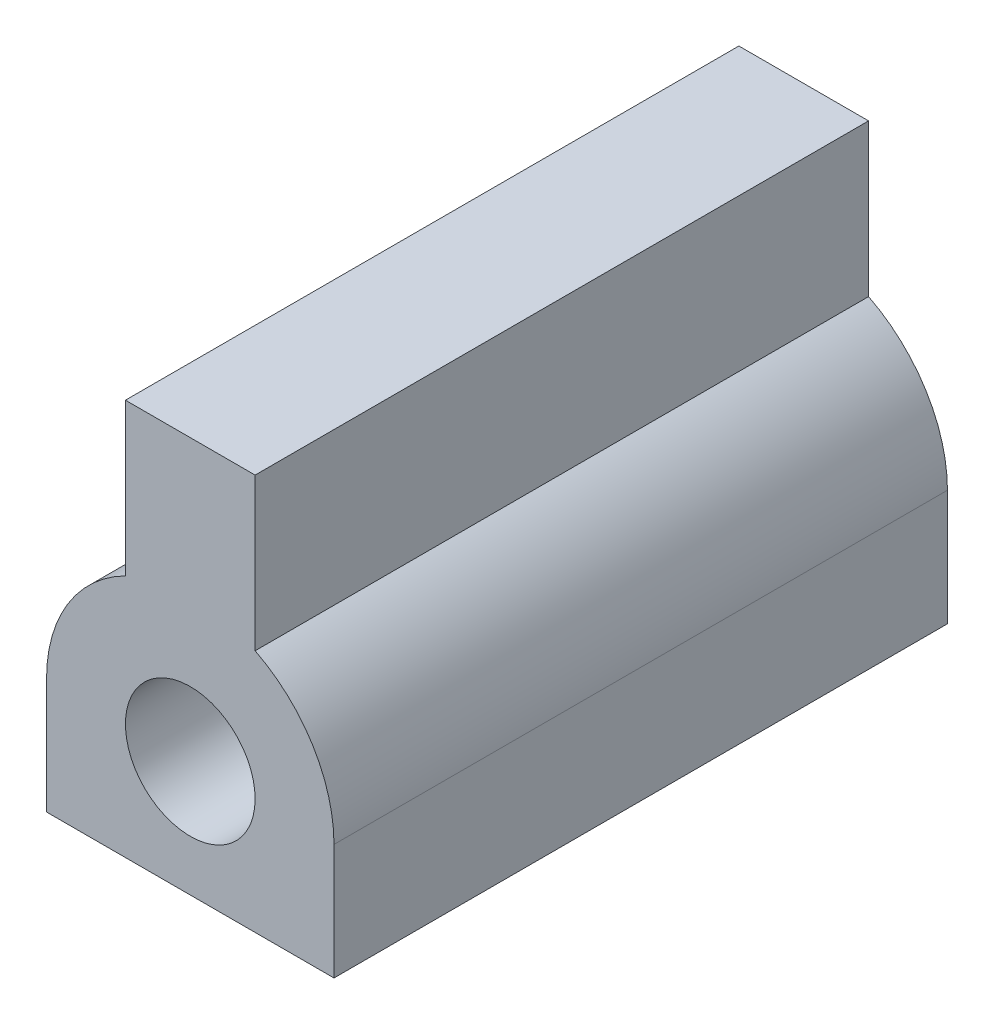
ISO-10303-21;
HEADER;
FILE_DESCRIPTION(('STEP AP214'),'2;1');
FILE_NAME('part.step','',(''),(''),'','','');
FILE_SCHEMA(('AUTOMOTIVE_DESIGN { 1 0 10303 214 1 1 1 1 }'));
ENDSEC;
DATA;
#1=APPLICATION_CONTEXT('core data for automotive mechanical design processes');
#2=APPLICATION_PROTOCOL_DEFINITION('international standard','automotive_design',2000,#1);
#3=PRODUCT_CONTEXT('',#1,'mechanical');
#4=PRODUCT('Part','Part','',(#3));
#5=PRODUCT_RELATED_PRODUCT_CATEGORY('part','',(#4));
#6=PRODUCT_DEFINITION_FORMATION('','',#4);
#7=PRODUCT_DEFINITION_CONTEXT('part definition',#1,'design');
#8=PRODUCT_DEFINITION('design','',#6,#7);
#9=PRODUCT_DEFINITION_SHAPE('','',#8);
#10=(LENGTH_UNIT() NAMED_UNIT(*) SI_UNIT(.MILLI.,.METRE.));
#11=(NAMED_UNIT(*) PLANE_ANGLE_UNIT() SI_UNIT($,.RADIAN.));
#12=(NAMED_UNIT(*) SI_UNIT($,.STERADIAN.) SOLID_ANGLE_UNIT());
#13=UNCERTAINTY_MEASURE_WITH_UNIT(LENGTH_MEASURE(1.E-05),#10,'distance_accuracy_value','');
#14=(GEOMETRIC_REPRESENTATION_CONTEXT(3) GLOBAL_UNCERTAINTY_ASSIGNED_CONTEXT((#13)) GLOBAL_UNIT_ASSIGNED_CONTEXT((#10,
#11,#12)) REPRESENTATION_CONTEXT('',''));
#15=CARTESIAN_POINT('',(0.,0.,0.));
#16=DIRECTION('',(0.,0.,1.));
#17=DIRECTION('',(1.,0.,0.));
#18=AXIS2_PLACEMENT_3D('',#15,#16,#17);
#19=CARTESIAN_POINT('',(0.,0.,22.225));
#20=DIRECTION('',(0.,0.,-1.));
#21=DIRECTION('',(-1.,0.,0.));
#22=AXIS2_PLACEMENT_3D('',#19,#20,#21);
#23=PLANE('',#22);
#24=DIRECTION('',(0.,-1.,0.));
#25=VECTOR('',#24,1.);
#26=CARTESIAN_POINT('',(-10.414,-8.382,22.225));
#27=LINE('',#26,#25);
#28=CARTESIAN_POINT('',(-10.414,0.,22.225));
#29=VERTEX_POINT('',#28);
#30=CARTESIAN_POINT('',(-10.414,-8.382,22.225));
#31=VERTEX_POINT('',#30);
#32=EDGE_CURVE('E146',#29,#31,#27,.T.);
#33=ORIENTED_EDGE('',*,*,#32,.T.);
#34=DIRECTION('',(1.,0.,0.));
#35=VECTOR('',#34,1.);
#36=CARTESIAN_POINT('',(10.414,-8.382,22.225));
#37=LINE('',#36,#35);
#38=CARTESIAN_POINT('',(10.414,-8.382,22.225));
#39=VERTEX_POINT('',#38);
#40=EDGE_CURVE('E94',#31,#39,#37,.T.);
#41=ORIENTED_EDGE('',*,*,#40,.T.);
#42=DIRECTION('',(0.,1.,0.));
#43=VECTOR('',#42,1.);
#44=CARTESIAN_POINT('',(10.414,0.,22.225));
#45=LINE('',#44,#43);
#46=CARTESIAN_POINT('',(10.414,0.,22.225));
#47=VERTEX_POINT('',#46);
#48=EDGE_CURVE('E161',#39,#47,#45,.T.);
#49=ORIENTED_EDGE('',*,*,#48,.T.);
#50=CARTESIAN_POINT('',(0.,0.,22.225));
#51=DIRECTION('',(0.,0.,1.));
#52=DIRECTION('',(-1.,0.,0.));
#53=AXIS2_PLACEMENT_3D('',#50,#51,#52);
#54=CIRCLE('',#53,10.414);
#55=CARTESIAN_POINT('',(4.699,9.29358891924966,22.225));
#56=VERTEX_POINT('',#55);
#57=EDGE_CURVE('E174',#47,#56,#54,.T.);
#58=ORIENTED_EDGE('',*,*,#57,.T.);
#59=DIRECTION('',(0.,1.,0.));
#60=VECTOR('',#59,1.);
#61=CARTESIAN_POINT('',(4.699,20.32,22.225));
#62=LINE('',#61,#60);
#63=CARTESIAN_POINT('',(4.699,20.32,22.225));
#64=VERTEX_POINT('',#63);
#65=EDGE_CURVE('E113',#56,#64,#62,.T.);
#66=ORIENTED_EDGE('',*,*,#65,.T.);
#67=DIRECTION('',(-1.,0.,0.));
#68=VECTOR('',#67,1.);
#69=CARTESIAN_POINT('',(-4.699,20.32,22.225));
#70=LINE('',#69,#68);
#71=CARTESIAN_POINT('',(-4.699,20.32,22.225));
#72=VERTEX_POINT('',#71);
#73=EDGE_CURVE('E107',#64,#72,#70,.T.);
#74=ORIENTED_EDGE('',*,*,#73,.T.);
#75=DIRECTION('',(0.,-1.,0.));
#76=VECTOR('',#75,1.);
#77=CARTESIAN_POINT('',(-4.699,9.29358891924965,22.225));
#78=LINE('',#77,#76);
#79=CARTESIAN_POINT('',(-4.699,9.29358891924965,22.225));
#80=VERTEX_POINT('',#79);
#81=EDGE_CURVE('E111',#72,#80,#78,.T.);
#82=ORIENTED_EDGE('',*,*,#81,.T.);
#83=CARTESIAN_POINT('',(0.,0.,22.225));
#84=DIRECTION('',(0.,0.,1.));
#85=DIRECTION('',(-1.,0.,0.));
#86=AXIS2_PLACEMENT_3D('',#83,#84,#85);
#87=CIRCLE('',#86,10.414);
#88=EDGE_CURVE('E51',#80,#29,#87,.T.);
#89=ORIENTED_EDGE('',*,*,#88,.T.);
#90=EDGE_LOOP('',(#33,#41,#49,#58,#66,#74,#82,#89));
#91=FACE_BOUND('',#90,.T.);
#92=CARTESIAN_POINT('',(0.,0.,22.225));
#93=DIRECTION('',(0.,0.,1.));
#94=DIRECTION('',(1.,0.,0.));
#95=AXIS2_PLACEMENT_3D('',#92,#93,#94);
#96=CIRCLE('',#95,4.699);
#97=CARTESIAN_POINT('',(4.699,0.,22.225));
#98=VERTEX_POINT('',#97);
#99=EDGE_CURVE('E135',#98,#98,#96,.T.);
#100=ORIENTED_EDGE('',*,*,#99,.F.);
#101=EDGE_LOOP('',(#100));
#102=FACE_BOUND('',#101,.T.);
#103=ADVANCED_FACE('F34',(#91,#102),#23,.F.);
#104=CARTESIAN_POINT('',(0.,0.,-22.225));
#105=DIRECTION('',(0.,0.,-1.));
#106=DIRECTION('',(-1.,0.,0.));
#107=AXIS2_PLACEMENT_3D('',#104,#105,#106);
#108=PLANE('',#107);
#109=DIRECTION('',(0.,-1.,0.));
#110=VECTOR('',#109,1.);
#111=CARTESIAN_POINT('',(-10.414,-8.382,-22.225));
#112=LINE('',#111,#110);
#113=CARTESIAN_POINT('',(-10.414,0.,-22.225));
#114=VERTEX_POINT('',#113);
#115=CARTESIAN_POINT('',(-10.414,-8.382,-22.225));
#116=VERTEX_POINT('',#115);
#117=EDGE_CURVE('E131',#114,#116,#112,.T.);
#118=ORIENTED_EDGE('',*,*,#117,.F.);
#119=CARTESIAN_POINT('',(0.,0.,-22.225));
#120=DIRECTION('',(0.,0.,1.));
#121=DIRECTION('',(-1.,0.,0.));
#122=AXIS2_PLACEMENT_3D('',#119,#120,#121);
#123=CIRCLE('',#122,10.414);
#124=CARTESIAN_POINT('',(-4.699,9.29358891924965,-22.225));
#125=VERTEX_POINT('',#124);
#126=EDGE_CURVE('E86',#125,#114,#123,.T.);
#127=ORIENTED_EDGE('',*,*,#126,.F.);
#128=DIRECTION('',(0.,-1.,0.));
#129=VECTOR('',#128,1.);
#130=CARTESIAN_POINT('',(-4.699,9.29358891924965,-22.225));
#131=LINE('',#130,#129);
#132=CARTESIAN_POINT('',(-4.699,20.32,-22.225));
#133=VERTEX_POINT('',#132);
#134=EDGE_CURVE('E80',#133,#125,#131,.T.);
#135=ORIENTED_EDGE('',*,*,#134,.F.);
#136=DIRECTION('',(-1.,0.,0.));
#137=VECTOR('',#136,1.);
#138=CARTESIAN_POINT('',(-4.699,20.32,-22.225));
#139=LINE('',#138,#137);
#140=CARTESIAN_POINT('',(4.699,20.32,-22.225));
#141=VERTEX_POINT('',#140);
#142=EDGE_CURVE('E121',#141,#133,#139,.T.);
#143=ORIENTED_EDGE('',*,*,#142,.F.);
#144=DIRECTION('',(0.,1.,0.));
#145=VECTOR('',#144,1.);
#146=CARTESIAN_POINT('',(4.699,20.32,-22.225));
#147=LINE('',#146,#145);
#148=CARTESIAN_POINT('',(4.699,9.29358891924966,-22.225));
#149=VERTEX_POINT('',#148);
#150=EDGE_CURVE('E141',#149,#141,#147,.T.);
#151=ORIENTED_EDGE('',*,*,#150,.F.);
#152=CARTESIAN_POINT('',(0.,0.,-22.225));
#153=DIRECTION('',(0.,0.,1.));
#154=DIRECTION('',(-1.,0.,0.));
#155=AXIS2_PLACEMENT_3D('',#152,#153,#154);
#156=CIRCLE('',#155,10.414);
#157=CARTESIAN_POINT('',(10.414,0.,-22.225));
#158=VERTEX_POINT('',#157);
#159=EDGE_CURVE('E139',#158,#149,#156,.T.);
#160=ORIENTED_EDGE('',*,*,#159,.F.);
#161=DIRECTION('',(0.,1.,0.));
#162=VECTOR('',#161,1.);
#163=CARTESIAN_POINT('',(10.414,0.,-22.225));
#164=LINE('',#163,#162);
#165=CARTESIAN_POINT('',(10.414,-8.382,-22.225));
#166=VERTEX_POINT('',#165);
#167=EDGE_CURVE('E137',#166,#158,#164,.T.);
#168=ORIENTED_EDGE('',*,*,#167,.F.);
#169=DIRECTION('',(1.,0.,0.));
#170=VECTOR('',#169,1.);
#171=CARTESIAN_POINT('',(10.414,-8.382,-22.225));
#172=LINE('',#171,#170);
#173=EDGE_CURVE('E134',#116,#166,#172,.T.);
#174=ORIENTED_EDGE('',*,*,#173,.F.);
#175=EDGE_LOOP('',(#118,#127,#135,#143,#151,#160,#168,#174));
#176=FACE_BOUND('',#175,.T.);
#177=CARTESIAN_POINT('',(0.,0.,-22.225));
#178=DIRECTION('',(0.,0.,1.));
#179=DIRECTION('',(1.,0.,0.));
#180=AXIS2_PLACEMENT_3D('',#177,#178,#179);
#181=CIRCLE('',#180,4.699);
#182=CARTESIAN_POINT('',(4.699,0.,-22.225));
#183=VERTEX_POINT('',#182);
#184=EDGE_CURVE('E180',#183,#183,#181,.T.);
#185=ORIENTED_EDGE('',*,*,#184,.T.);
#186=EDGE_LOOP('',(#185));
#187=FACE_BOUND('',#186,.T.);
#188=ADVANCED_FACE('F165',(#176,#187),#108,.T.);
#189=CARTESIAN_POINT('',(-10.414,-8.382,22.225));
#190=DIRECTION('',(1.,0.,0.));
#191=DIRECTION('',(0.,0.,-1.));
#192=AXIS2_PLACEMENT_3D('',#189,#190,#191);
#193=PLANE('',#192);
#194=ORIENTED_EDGE('',*,*,#117,.T.);
#195=DIRECTION('',(0.,0.,-1.));
#196=VECTOR('',#195,1.);
#197=CARTESIAN_POINT('',(-10.414,-8.382,22.225));
#198=LINE('',#197,#196);
#199=EDGE_CURVE('E11',#31,#116,#198,.T.);
#200=ORIENTED_EDGE('',*,*,#199,.F.);
#201=ORIENTED_EDGE('',*,*,#32,.F.);
#202=DIRECTION('',(0.,0.,-1.));
#203=VECTOR('',#202,1.);
#204=CARTESIAN_POINT('',(-10.414,0.,22.225));
#205=LINE('',#204,#203);
#206=EDGE_CURVE('E127',#29,#114,#205,.T.);
#207=ORIENTED_EDGE('',*,*,#206,.T.);
#208=EDGE_LOOP('',(#194,#200,#201,#207));
#209=FACE_BOUND('',#208,.T.);
#210=ADVANCED_FACE('F36',(#209),#193,.F.);
#211=CARTESIAN_POINT('',(10.414,-8.382,22.225));
#212=DIRECTION('',(0.,1.,0.));
#213=DIRECTION('',(-1.,0.,0.));
#214=AXIS2_PLACEMENT_3D('',#211,#212,#213);
#215=PLANE('',#214);
#216=ORIENTED_EDGE('',*,*,#173,.T.);
#217=DIRECTION('',(0.,0.,-1.));
#218=VECTOR('',#217,1.);
#219=CARTESIAN_POINT('',(10.414,-8.382,22.225));
#220=LINE('',#219,#218);
#221=EDGE_CURVE('E43',#39,#166,#220,.T.);
#222=ORIENTED_EDGE('',*,*,#221,.F.);
#223=ORIENTED_EDGE('',*,*,#40,.F.);
#224=ORIENTED_EDGE('',*,*,#199,.T.);
#225=EDGE_LOOP('',(#216,#222,#223,#224));
#226=FACE_BOUND('',#225,.T.);
#227=ADVANCED_FACE('F208',(#226),#215,.F.);
#228=CARTESIAN_POINT('',(10.414,0.,22.225));
#229=DIRECTION('',(-1.,0.,0.));
#230=DIRECTION('',(0.,0.,1.));
#231=AXIS2_PLACEMENT_3D('',#228,#229,#230);
#232=PLANE('',#231);
#233=ORIENTED_EDGE('',*,*,#167,.T.);
#234=DIRECTION('',(0.,0.,-1.));
#235=VECTOR('',#234,1.);
#236=CARTESIAN_POINT('',(10.414,0.,22.225));
#237=LINE('',#236,#235);
#238=EDGE_CURVE('E153',#47,#158,#237,.T.);
#239=ORIENTED_EDGE('',*,*,#238,.F.);
#240=ORIENTED_EDGE('',*,*,#48,.F.);
#241=ORIENTED_EDGE('',*,*,#221,.T.);
#242=EDGE_LOOP('',(#233,#239,#240,#241));
#243=FACE_BOUND('',#242,.T.);
#244=ADVANCED_FACE('F159',(#243),#232,.F.);
#245=CARTESIAN_POINT('',(0.,0.,22.225));
#246=DIRECTION('',(0.,0.,-1.));
#247=DIRECTION('',(-1.,0.,0.));
#248=AXIS2_PLACEMENT_3D('',#245,#246,#247);
#249=CYLINDRICAL_SURFACE('',#248,10.414);
#250=ORIENTED_EDGE('',*,*,#159,.T.);
#251=DIRECTION('',(0.,0.,-1.));
#252=VECTOR('',#251,1.);
#253=CARTESIAN_POINT('',(4.699,9.29358891924966,22.225));
#254=LINE('',#253,#252);
#255=EDGE_CURVE('E150',#56,#149,#254,.T.);
#256=ORIENTED_EDGE('',*,*,#255,.F.);
#257=ORIENTED_EDGE('',*,*,#57,.F.);
#258=ORIENTED_EDGE('',*,*,#238,.T.);
#259=EDGE_LOOP('',(#250,#256,#257,#258));
#260=FACE_BOUND('',#259,.T.);
#261=ADVANCED_FACE('F170',(#260),#249,.T.);
#262=CARTESIAN_POINT('',(4.699,20.32,22.225));
#263=DIRECTION('',(-1.,0.,0.));
#264=DIRECTION('',(0.,0.,1.));
#265=AXIS2_PLACEMENT_3D('',#262,#263,#264);
#266=PLANE('',#265);
#267=ORIENTED_EDGE('',*,*,#150,.T.);
#268=DIRECTION('',(0.,0.,-1.));
#269=VECTOR('',#268,1.);
#270=CARTESIAN_POINT('',(4.699,20.32,22.225));
#271=LINE('',#270,#269);
#272=EDGE_CURVE('E122',#64,#141,#271,.T.);
#273=ORIENTED_EDGE('',*,*,#272,.F.);
#274=ORIENTED_EDGE('',*,*,#65,.F.);
#275=ORIENTED_EDGE('',*,*,#255,.T.);
#276=EDGE_LOOP('',(#267,#273,#274,#275));
#277=FACE_BOUND('',#276,.T.);
#278=ADVANCED_FACE('F173',(#277),#266,.F.);
#279=CARTESIAN_POINT('',(-4.699,20.32,22.225));
#280=DIRECTION('',(0.,-1.,0.));
#281=DIRECTION('',(0.,0.,-1.));
#282=AXIS2_PLACEMENT_3D('',#279,#280,#281);
#283=PLANE('',#282);
#284=ORIENTED_EDGE('',*,*,#142,.T.);
#285=DIRECTION('',(0.,0.,-1.));
#286=VECTOR('',#285,1.);
#287=CARTESIAN_POINT('',(-4.699,20.32,22.225));
#288=LINE('',#287,#286);
#289=EDGE_CURVE('E118',#72,#133,#288,.T.);
#290=ORIENTED_EDGE('',*,*,#289,.F.);
#291=ORIENTED_EDGE('',*,*,#73,.F.);
#292=ORIENTED_EDGE('',*,*,#272,.T.);
#293=EDGE_LOOP('',(#284,#290,#291,#292));
#294=FACE_BOUND('',#293,.T.);
#295=ADVANCED_FACE('F119',(#294),#283,.F.);
#296=CARTESIAN_POINT('',(-4.699,9.29358891924965,22.225));
#297=DIRECTION('',(1.,0.,0.));
#298=DIRECTION('',(0.,1.,0.));
#299=AXIS2_PLACEMENT_3D('',#296,#297,#298);
#300=PLANE('',#299);
#301=ORIENTED_EDGE('',*,*,#134,.T.);
#302=DIRECTION('',(0.,0.,-1.));
#303=VECTOR('',#302,1.);
#304=CARTESIAN_POINT('',(-4.699,9.29358891924965,22.225));
#305=LINE('',#304,#303);
#306=EDGE_CURVE('E123',#80,#125,#305,.T.);
#307=ORIENTED_EDGE('',*,*,#306,.F.);
#308=ORIENTED_EDGE('',*,*,#81,.F.);
#309=ORIENTED_EDGE('',*,*,#289,.T.);
#310=EDGE_LOOP('',(#301,#307,#308,#309));
#311=FACE_BOUND('',#310,.T.);
#312=ADVANCED_FACE('F125',(#311),#300,.F.);
#313=CARTESIAN_POINT('',(0.,0.,22.225));
#314=DIRECTION('',(0.,0.,-1.));
#315=DIRECTION('',(-1.,0.,0.));
#316=AXIS2_PLACEMENT_3D('',#313,#314,#315);
#317=CYLINDRICAL_SURFACE('',#316,10.414);
#318=ORIENTED_EDGE('',*,*,#126,.T.);
#319=ORIENTED_EDGE('',*,*,#206,.F.);
#320=ORIENTED_EDGE('',*,*,#88,.F.);
#321=ORIENTED_EDGE('',*,*,#306,.T.);
#322=EDGE_LOOP('',(#318,#319,#320,#321));
#323=FACE_BOUND('',#322,.T.);
#324=ADVANCED_FACE('F196',(#323),#317,.T.);
#325=CARTESIAN_POINT('',(0.,0.,22.225));
#326=DIRECTION('',(0.,0.,-1.));
#327=DIRECTION('',(-1.,0.,0.));
#328=AXIS2_PLACEMENT_3D('',#325,#326,#327);
#329=CYLINDRICAL_SURFACE('',#328,4.699);
#330=ORIENTED_EDGE('',*,*,#99,.T.);
#331=EDGE_LOOP('',(#330));
#332=FACE_BOUND('',#331,.T.);
#333=ORIENTED_EDGE('',*,*,#184,.F.);
#334=EDGE_LOOP('',(#333));
#335=FACE_BOUND('',#334,.T.);
#336=ADVANCED_FACE('F186',(#332,#335),#329,.F.);
#337=CLOSED_SHELL('',(#103,#188,#210,#227,#244,#261,#278,#295,#312,#324,#336));
#338=MANIFOLD_SOLID_BREP('B2',#337);
#339=ADVANCED_BREP_SHAPE_REPRESENTATION('',(#18,#338),#14);
#340=SHAPE_DEFINITION_REPRESENTATION(#9,#339);
ENDSEC;
END-ISO-10303-21;
